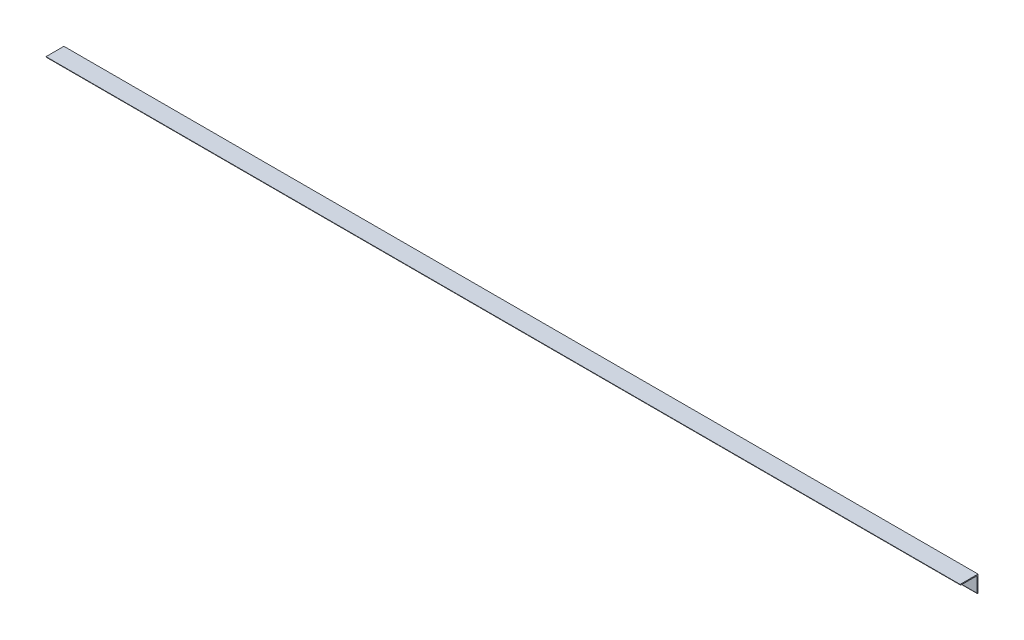
ISO-10303-21;
HEADER;
FILE_DESCRIPTION(('STEP AP214'),'2;1');
FILE_NAME('part.step','',(''),(''),'','','');
FILE_SCHEMA(('AUTOMOTIVE_DESIGN { 1 0 10303 214 1 1 1 1 }'));
ENDSEC;
DATA;
#1=APPLICATION_CONTEXT('core data for automotive mechanical design processes');
#2=APPLICATION_PROTOCOL_DEFINITION('international standard','automotive_design',2000,#1);
#3=PRODUCT_CONTEXT('',#1,'mechanical');
#4=PRODUCT('Part','Part','',(#3));
#5=PRODUCT_RELATED_PRODUCT_CATEGORY('part','',(#4));
#6=PRODUCT_DEFINITION_FORMATION('','',#4);
#7=PRODUCT_DEFINITION_CONTEXT('part definition',#1,'design');
#8=PRODUCT_DEFINITION('design','',#6,#7);
#9=PRODUCT_DEFINITION_SHAPE('','',#8);
#10=(LENGTH_UNIT() NAMED_UNIT(*) SI_UNIT(.MILLI.,.METRE.));
#11=(NAMED_UNIT(*) PLANE_ANGLE_UNIT() SI_UNIT($,.RADIAN.));
#12=(NAMED_UNIT(*) SI_UNIT($,.STERADIAN.) SOLID_ANGLE_UNIT());
#13=UNCERTAINTY_MEASURE_WITH_UNIT(LENGTH_MEASURE(1.E-05),#10,'distance_accuracy_value','');
#14=(GEOMETRIC_REPRESENTATION_CONTEXT(3) GLOBAL_UNCERTAINTY_ASSIGNED_CONTEXT((#13)) GLOBAL_UNIT_ASSIGNED_CONTEXT((#10,
#11,#12)) REPRESENTATION_CONTEXT('',''));
#15=CARTESIAN_POINT('',(0.,0.,0.));
#16=DIRECTION('',(0.,0.,1.));
#17=DIRECTION('',(1.,0.,0.));
#18=AXIS2_PLACEMENT_3D('',#15,#16,#17);
#19=CARTESIAN_POINT('',(-4595.,-85.,0.));
#20=DIRECTION('',(0.,0.,1.));
#21=DIRECTION('',(1.,0.,0.));
#22=AXIS2_PLACEMENT_3D('',#19,#20,#21);
#23=PLANE('',#22);
#24=DIRECTION('',(0.,-1.,0.));
#25=VECTOR('',#24,1.);
#26=CARTESIAN_POINT('',(0.,-85.,0.));
#27=LINE('',#26,#25);
#28=CARTESIAN_POINT('',(0.,0.,0.));
#29=VERTEX_POINT('',#28);
#30=CARTESIAN_POINT('',(0.,-85.,0.));
#31=VERTEX_POINT('',#30);
#32=EDGE_CURVE('E155',#29,#31,#27,.T.);
#33=ORIENTED_EDGE('',*,*,#32,.T.);
#34=DIRECTION('',(1.,0.,0.));
#35=VECTOR('',#34,1.);
#36=CARTESIAN_POINT('',(-4595.,-85.,0.));
#37=LINE('',#36,#35);
#38=CARTESIAN_POINT('',(-4595.,-85.,0.));
#39=VERTEX_POINT('',#38);
#40=EDGE_CURVE('E13',#39,#31,#37,.T.);
#41=ORIENTED_EDGE('',*,*,#40,.F.);
#42=DIRECTION('',(0.,-1.,0.));
#43=VECTOR('',#42,1.);
#44=CARTESIAN_POINT('',(-4595.,-85.,0.));
#45=LINE('',#44,#43);
#46=CARTESIAN_POINT('',(-4595.,0.,0.));
#47=VERTEX_POINT('',#46);
#48=EDGE_CURVE('E167',#47,#39,#45,.T.);
#49=ORIENTED_EDGE('',*,*,#48,.F.);
#50=DIRECTION('',(1.,0.,0.));
#51=VECTOR('',#50,1.);
#52=CARTESIAN_POINT('',(-4595.,0.,0.));
#53=LINE('',#52,#51);
#54=EDGE_CURVE('E151',#47,#29,#53,.T.);
#55=ORIENTED_EDGE('',*,*,#54,.T.);
#56=EDGE_LOOP('',(#33,#41,#49,#55));
#57=FACE_BOUND('',#56,.T.);
#58=ADVANCED_FACE('F65',(#57),#23,.F.);
#59=CARTESIAN_POINT('',(-4595.,-80.,0.));
#60=DIRECTION('',(1.,0.,0.));
#61=DIRECTION('',(0.,0.,-1.));
#62=AXIS2_PLACEMENT_3D('',#59,#60,#61);
#63=CYLINDRICAL_SURFACE('',#62,5.);
#64=CARTESIAN_POINT('',(0.,-80.,0.));
#65=DIRECTION('',(-1.,0.,0.));
#66=DIRECTION('',(0.,0.,1.));
#67=AXIS2_PLACEMENT_3D('',#64,#65,#66);
#68=CIRCLE('',#67,5.);
#69=CARTESIAN_POINT('',(0.,-80.,4.99999999999999));
#70=VERTEX_POINT('',#69);
#71=EDGE_CURVE('E158',#31,#70,#68,.T.);
#72=ORIENTED_EDGE('',*,*,#71,.T.);
#73=DIRECTION('',(1.,0.,0.));
#74=VECTOR('',#73,1.);
#75=CARTESIAN_POINT('',(-4595.,-80.,4.99999999999999));
#76=LINE('',#75,#74);
#77=CARTESIAN_POINT('',(-4595.,-80.,4.99999999999999));
#78=VERTEX_POINT('',#77);
#79=EDGE_CURVE('E73',#78,#70,#76,.T.);
#80=ORIENTED_EDGE('',*,*,#79,.F.);
#81=CARTESIAN_POINT('',(-4595.,-80.,0.));
#82=DIRECTION('',(-1.,0.,0.));
#83=DIRECTION('',(0.,0.,1.));
#84=AXIS2_PLACEMENT_3D('',#81,#82,#83);
#85=CIRCLE('',#84,5.);
#86=EDGE_CURVE('E121',#39,#78,#85,.T.);
#87=ORIENTED_EDGE('',*,*,#86,.F.);
#88=ORIENTED_EDGE('',*,*,#40,.T.);
#89=EDGE_LOOP('',(#72,#80,#87,#88));
#90=FACE_BOUND('',#89,.T.);
#91=ADVANCED_FACE('F192',(#90),#63,.T.);
#92=CARTESIAN_POINT('',(-4595.,-10.,5.));
#93=DIRECTION('',(0.,0.,-1.));
#94=DIRECTION('',(0.,1.,0.));
#95=AXIS2_PLACEMENT_3D('',#92,#93,#94);
#96=PLANE('',#95);
#97=DIRECTION('',(0.,1.,0.));
#98=VECTOR('',#97,1.);
#99=CARTESIAN_POINT('',(0.,-10.,5.));
#100=LINE('',#99,#98);
#101=CARTESIAN_POINT('',(0.,-10.,5.));
#102=VERTEX_POINT('',#101);
#103=EDGE_CURVE('E160',#70,#102,#100,.T.);
#104=ORIENTED_EDGE('',*,*,#103,.T.);
#105=DIRECTION('',(1.,0.,0.));
#106=VECTOR('',#105,1.);
#107=CARTESIAN_POINT('',(-4595.,-10.,5.));
#108=LINE('',#107,#106);
#109=CARTESIAN_POINT('',(-4595.,-10.,5.));
#110=VERTEX_POINT('',#109);
#111=EDGE_CURVE('E171',#110,#102,#108,.T.);
#112=ORIENTED_EDGE('',*,*,#111,.F.);
#113=DIRECTION('',(0.,1.,0.));
#114=VECTOR('',#113,1.);
#115=CARTESIAN_POINT('',(-4595.,-10.,5.));
#116=LINE('',#115,#114);
#117=EDGE_CURVE('E179',#78,#110,#116,.T.);
#118=ORIENTED_EDGE('',*,*,#117,.F.);
#119=ORIENTED_EDGE('',*,*,#79,.T.);
#120=EDGE_LOOP('',(#104,#112,#118,#119));
#121=FACE_BOUND('',#120,.T.);
#122=ADVANCED_FACE('F177',(#121),#96,.F.);
#123=CARTESIAN_POINT('',(-4595.,-10.,10.));
#124=DIRECTION('',(1.,0.,0.));
#125=DIRECTION('',(0.,0.,-1.));
#126=AXIS2_PLACEMENT_3D('',#123,#124,#125);
#127=CYLINDRICAL_SURFACE('',#126,5.);
#128=CARTESIAN_POINT('',(0.,-10.,10.));
#129=DIRECTION('',(1.,0.,0.));
#130=DIRECTION('',(0.,0.,-1.));
#131=AXIS2_PLACEMENT_3D('',#128,#129,#130);
#132=CIRCLE('',#131,5.);
#133=CARTESIAN_POINT('',(0.,-5.,10.));
#134=VERTEX_POINT('',#133);
#135=EDGE_CURVE('E162',#102,#134,#132,.T.);
#136=ORIENTED_EDGE('',*,*,#135,.T.);
#137=DIRECTION('',(1.,0.,0.));
#138=VECTOR('',#137,1.);
#139=CARTESIAN_POINT('',(-4595.,-5.,10.));
#140=LINE('',#139,#138);
#141=CARTESIAN_POINT('',(-4595.,-5.,10.));
#142=VERTEX_POINT('',#141);
#143=EDGE_CURVE('E146',#142,#134,#140,.T.);
#144=ORIENTED_EDGE('',*,*,#143,.F.);
#145=CARTESIAN_POINT('',(-4595.,-10.,10.));
#146=DIRECTION('',(1.,0.,0.));
#147=DIRECTION('',(0.,0.,-1.));
#148=AXIS2_PLACEMENT_3D('',#145,#146,#147);
#149=CIRCLE('',#148,5.);
#150=EDGE_CURVE('E137',#110,#142,#149,.T.);
#151=ORIENTED_EDGE('',*,*,#150,.F.);
#152=ORIENTED_EDGE('',*,*,#111,.T.);
#153=EDGE_LOOP('',(#136,#144,#151,#152));
#154=FACE_BOUND('',#153,.T.);
#155=ADVANCED_FACE('F185',(#154),#127,.F.);
#156=CARTESIAN_POINT('',(-4595.,-4.99999999999999,85.));
#157=DIRECTION('',(0.,1.,0.));
#158=DIRECTION('',(0.,0.,1.));
#159=AXIS2_PLACEMENT_3D('',#156,#157,#158);
#160=PLANE('',#159);
#161=DIRECTION('',(0.,0.,1.));
#162=VECTOR('',#161,1.);
#163=CARTESIAN_POINT('',(0.,-4.99999999999999,85.));
#164=LINE('',#163,#162);
#165=CARTESIAN_POINT('',(0.,-4.99999999999999,85.));
#166=VERTEX_POINT('',#165);
#167=EDGE_CURVE('E145',#134,#166,#164,.T.);
#168=ORIENTED_EDGE('',*,*,#167,.T.);
#169=DIRECTION('',(1.,0.,0.));
#170=VECTOR('',#169,1.);
#171=CARTESIAN_POINT('',(-4595.,-4.99999999999999,85.));
#172=LINE('',#171,#170);
#173=CARTESIAN_POINT('',(-4595.,-4.99999999999999,85.));
#174=VERTEX_POINT('',#173);
#175=EDGE_CURVE('E142',#174,#166,#172,.T.);
#176=ORIENTED_EDGE('',*,*,#175,.F.);
#177=DIRECTION('',(0.,0.,1.));
#178=VECTOR('',#177,1.);
#179=CARTESIAN_POINT('',(-4595.,-4.99999999999999,85.));
#180=LINE('',#179,#178);
#181=EDGE_CURVE('E131',#142,#174,#180,.T.);
#182=ORIENTED_EDGE('',*,*,#181,.F.);
#183=ORIENTED_EDGE('',*,*,#143,.T.);
#184=EDGE_LOOP('',(#168,#176,#182,#183));
#185=FACE_BOUND('',#184,.T.);
#186=ADVANCED_FACE('F143',(#185),#160,.F.);
#187=CARTESIAN_POINT('',(-4595.,0.,85.));
#188=DIRECTION('',(1.,0.,0.));
#189=DIRECTION('',(0.,0.,-1.));
#190=AXIS2_PLACEMENT_3D('',#187,#188,#189);
#191=CYLINDRICAL_SURFACE('',#190,5.);
#192=CARTESIAN_POINT('',(0.,0.,85.));
#193=DIRECTION('',(-1.,0.,0.));
#194=DIRECTION('',(0.,0.,-1.));
#195=AXIS2_PLACEMENT_3D('',#192,#193,#194);
#196=CIRCLE('',#195,5.);
#197=CARTESIAN_POINT('',(0.,0.,90.));
#198=VERTEX_POINT('',#197);
#199=EDGE_CURVE('E107',#166,#198,#196,.T.);
#200=ORIENTED_EDGE('',*,*,#199,.T.);
#201=DIRECTION('',(1.,0.,0.));
#202=VECTOR('',#201,1.);
#203=CARTESIAN_POINT('',(-4595.,0.,90.));
#204=LINE('',#203,#202);
#205=CARTESIAN_POINT('',(-4595.,0.,90.));
#206=VERTEX_POINT('',#205);
#207=EDGE_CURVE('E147',#206,#198,#204,.T.);
#208=ORIENTED_EDGE('',*,*,#207,.F.);
#209=CARTESIAN_POINT('',(-4595.,0.,85.));
#210=DIRECTION('',(-1.,0.,0.));
#211=DIRECTION('',(0.,0.,-1.));
#212=AXIS2_PLACEMENT_3D('',#209,#210,#211);
#213=CIRCLE('',#212,5.);
#214=EDGE_CURVE('E135',#174,#206,#213,.T.);
#215=ORIENTED_EDGE('',*,*,#214,.F.);
#216=ORIENTED_EDGE('',*,*,#175,.T.);
#217=EDGE_LOOP('',(#200,#208,#215,#216));
#218=FACE_BOUND('',#217,.T.);
#219=ADVANCED_FACE('F149',(#218),#191,.T.);
#220=CARTESIAN_POINT('',(-4595.,0.,0.));
#221=DIRECTION('',(0.,-1.,0.));
#222=DIRECTION('',(0.,0.,-1.));
#223=AXIS2_PLACEMENT_3D('',#220,#221,#222);
#224=PLANE('',#223);
#225=DIRECTION('',(0.,0.,-1.));
#226=VECTOR('',#225,1.);
#227=CARTESIAN_POINT('',(0.,0.,0.));
#228=LINE('',#227,#226);
#229=EDGE_CURVE('E113',#198,#29,#228,.T.);
#230=ORIENTED_EDGE('',*,*,#229,.T.);
#231=ORIENTED_EDGE('',*,*,#54,.F.);
#232=DIRECTION('',(0.,0.,-1.));
#233=VECTOR('',#232,1.);
#234=CARTESIAN_POINT('',(-4595.,0.,0.));
#235=LINE('',#234,#233);
#236=EDGE_CURVE('E81',#206,#47,#235,.T.);
#237=ORIENTED_EDGE('',*,*,#236,.F.);
#238=ORIENTED_EDGE('',*,*,#207,.T.);
#239=EDGE_LOOP('',(#230,#231,#237,#238));
#240=FACE_BOUND('',#239,.T.);
#241=ADVANCED_FACE('F206',(#240),#224,.F.);
#242=CARTESIAN_POINT('',(-4595.,0.,85.));
#243=DIRECTION('',(1.,0.,0.));
#244=DIRECTION('',(0.,0.,-1.));
#245=AXIS2_PLACEMENT_3D('',#242,#243,#244);
#246=PLANE('',#245);
#247=ORIENTED_EDGE('',*,*,#48,.T.);
#248=ORIENTED_EDGE('',*,*,#86,.T.);
#249=ORIENTED_EDGE('',*,*,#117,.T.);
#250=ORIENTED_EDGE('',*,*,#150,.T.);
#251=ORIENTED_EDGE('',*,*,#181,.T.);
#252=ORIENTED_EDGE('',*,*,#214,.T.);
#253=ORIENTED_EDGE('',*,*,#236,.T.);
#254=EDGE_LOOP('',(#247,#248,#249,#250,#251,#252,#253));
#255=FACE_BOUND('',#254,.T.);
#256=ADVANCED_FACE('F133',(#255),#246,.F.);
#257=CARTESIAN_POINT('',(0.,0.,85.));
#258=DIRECTION('',(1.,0.,0.));
#259=DIRECTION('',(0.,0.,-1.));
#260=AXIS2_PLACEMENT_3D('',#257,#258,#259);
#261=PLANE('',#260);
#262=ORIENTED_EDGE('',*,*,#32,.F.);
#263=ORIENTED_EDGE('',*,*,#229,.F.);
#264=ORIENTED_EDGE('',*,*,#199,.F.);
#265=ORIENTED_EDGE('',*,*,#167,.F.);
#266=ORIENTED_EDGE('',*,*,#135,.F.);
#267=ORIENTED_EDGE('',*,*,#103,.F.);
#268=ORIENTED_EDGE('',*,*,#71,.F.);
#269=EDGE_LOOP('',(#262,#263,#264,#265,#266,#267,#268));
#270=FACE_BOUND('',#269,.T.);
#271=ADVANCED_FACE('F183',(#270),#261,.T.);
#272=CLOSED_SHELL('',(#58,#91,#122,#155,#186,#219,#241,#256,#271));
#273=MANIFOLD_SOLID_BREP('B2',#272);
#274=ADVANCED_BREP_SHAPE_REPRESENTATION('',(#18,#273),#14);
#275=SHAPE_DEFINITION_REPRESENTATION(#9,#274);
ENDSEC;
END-ISO-10303-21;
